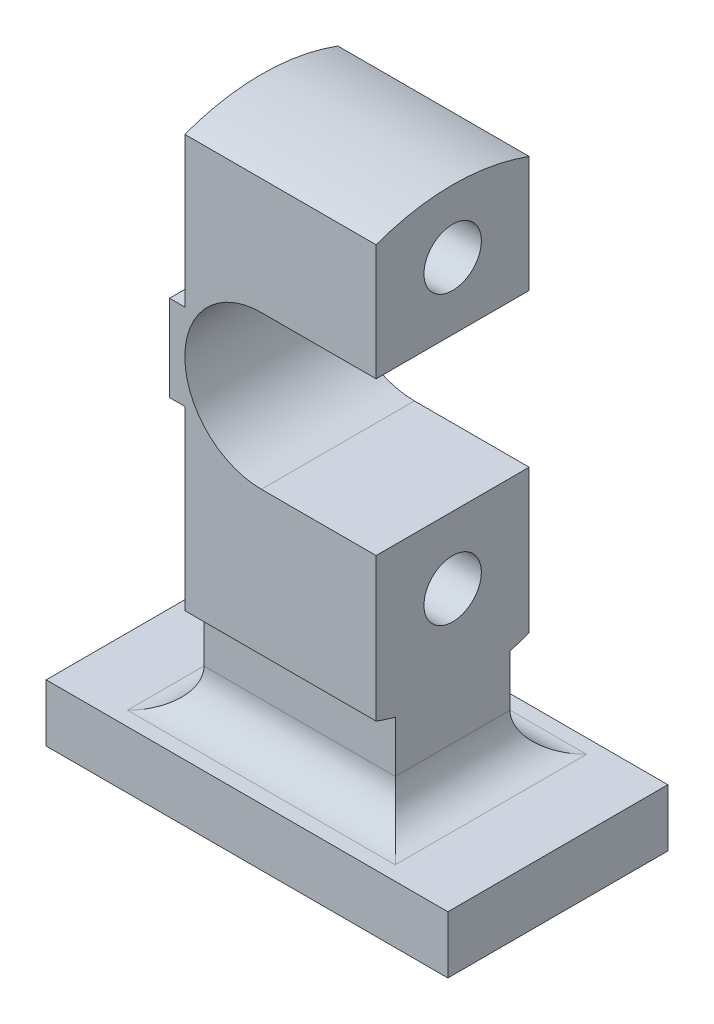
ISO-10303-21;
HEADER;
FILE_DESCRIPTION(('STEP AP214'),'2;1');
FILE_NAME('part.step','',(''),(''),'','','');
FILE_SCHEMA(('AUTOMOTIVE_DESIGN { 1 0 10303 214 1 1 1 1 }'));
ENDSEC;
DATA;
#1=APPLICATION_CONTEXT('core data for automotive mechanical design processes');
#2=APPLICATION_PROTOCOL_DEFINITION('international standard','automotive_design',2000,#1);
#3=PRODUCT_CONTEXT('',#1,'mechanical');
#4=PRODUCT('Part','Part','',(#3));
#5=PRODUCT_RELATED_PRODUCT_CATEGORY('part','',(#4));
#6=PRODUCT_DEFINITION_FORMATION('','',#4);
#7=PRODUCT_DEFINITION_CONTEXT('part definition',#1,'design');
#8=PRODUCT_DEFINITION('design','',#6,#7);
#9=PRODUCT_DEFINITION_SHAPE('','',#8);
#10=(LENGTH_UNIT() NAMED_UNIT(*) SI_UNIT(.MILLI.,.METRE.));
#11=(NAMED_UNIT(*) PLANE_ANGLE_UNIT() SI_UNIT($,.RADIAN.));
#12=(NAMED_UNIT(*) SI_UNIT($,.STERADIAN.) SOLID_ANGLE_UNIT());
#13=UNCERTAINTY_MEASURE_WITH_UNIT(LENGTH_MEASURE(1.E-05),#10,'distance_accuracy_value','');
#14=(GEOMETRIC_REPRESENTATION_CONTEXT(3) GLOBAL_UNCERTAINTY_ASSIGNED_CONTEXT((#13)) GLOBAL_UNIT_ASSIGNED_CONTEXT((#10,
#11,#12)) REPRESENTATION_CONTEXT('',''));
#15=CARTESIAN_POINT('',(0.,0.,0.));
#16=DIRECTION('',(0.,0.,1.));
#17=DIRECTION('',(1.,0.,0.));
#18=AXIS2_PLACEMENT_3D('',#15,#16,#17);
#19=CARTESIAN_POINT('',(50.,0.,0.));
#20=DIRECTION('',(1.,0.,0.));
#21=DIRECTION('',(0.,0.,-1.));
#22=AXIS2_PLACEMENT_3D('',#19,#20,#21);
#23=PLANE('',#22);
#24=CARTESIAN_POINT('',(50.,120.,0.));
#25=DIRECTION('',(1.,0.,0.));
#26=DIRECTION('',(0.,0.,-1.));
#27=AXIS2_PLACEMENT_3D('',#24,#25,#26);
#28=CIRCLE('',#27,15.);
#29=CARTESIAN_POINT('',(50.,120.,-15.));
#30=VERTEX_POINT('',#29);
#31=EDGE_CURVE('E240',#30,#30,#28,.T.);
#32=ORIENTED_EDGE('',*,*,#31,.F.);
#33=EDGE_LOOP('',(#32));
#34=FACE_BOUND('',#33,.T.);
#35=DIRECTION('',(0.,1.,0.));
#36=VECTOR('',#35,1.);
#37=CARTESIAN_POINT('',(50.,295.680123104319,-40.));
#38=LINE('',#37,#36);
#39=CARTESIAN_POINT('',(50.,80.0415365758403,-40.));
#40=VERTEX_POINT('',#39);
#41=CARTESIAN_POINT('',(50.,155.,-40.));
#42=VERTEX_POINT('',#41);
#43=EDGE_CURVE('E259',#40,#42,#38,.T.);
#44=ORIENTED_EDGE('',*,*,#43,.T.);
#45=DIRECTION('',(0.,0.,-1.));
#46=VECTOR('',#45,1.);
#47=CARTESIAN_POINT('',(50.,155.,57.5));
#48=LINE('',#47,#46);
#49=CARTESIAN_POINT('',(50.,155.,40.));
#50=VERTEX_POINT('',#49);
#51=EDGE_CURVE('E201',#50,#42,#48,.T.);
#52=ORIENTED_EDGE('',*,*,#51,.F.);
#53=DIRECTION('',(0.,-1.,0.));
#54=VECTOR('',#53,1.);
#55=CARTESIAN_POINT('',(50.,295.680123104319,40.));
#56=LINE('',#55,#54);
#57=CARTESIAN_POINT('',(50.,80.0415365758403,40.));
#58=VERTEX_POINT('',#57);
#59=EDGE_CURVE('E263',#50,#58,#56,.T.);
#60=ORIENTED_EDGE('',*,*,#59,.T.);
#61=CARTESIAN_POINT('',(50.,187.860829840079,0.));
#62=DIRECTION('',(1.,0.,0.));
#63=DIRECTION('',(0.,0.,-1.));
#64=AXIS2_PLACEMENT_3D('',#61,#62,#63);
#65=CIRCLE('',#64,115.);
#66=CARTESIAN_POINT('',(50.,76.8428132842069,30.));
#67=VERTEX_POINT('',#66);
#68=EDGE_CURVE('E254',#58,#67,#65,.T.);
#69=ORIENTED_EDGE('',*,*,#68,.T.);
#70=DIRECTION('',(0.,-1.,0.));
#71=VECTOR('',#70,1.);
#72=CARTESIAN_POINT('',(50.,25.3292008694039,30.));
#73=LINE('',#72,#71);
#74=CARTESIAN_POINT('',(50.,50.,30.));
#75=VERTEX_POINT('',#74);
#76=EDGE_CURVE('E301',#67,#75,#73,.T.);
#77=ORIENTED_EDGE('',*,*,#76,.T.);
#78=DIRECTION('',(0.,0.,-1.));
#79=VECTOR('',#78,1.);
#80=CARTESIAN_POINT('',(50.,50.,-30.));
#81=LINE('',#80,#79);
#82=CARTESIAN_POINT('',(50.,50.,-30.));
#83=VERTEX_POINT('',#82);
#84=EDGE_CURVE('E352',#75,#83,#81,.T.);
#85=ORIENTED_EDGE('',*,*,#84,.T.);
#86=DIRECTION('',(0.,1.,0.));
#87=VECTOR('',#86,1.);
#88=CARTESIAN_POINT('',(50.,25.3292008694039,-30.));
#89=LINE('',#88,#87);
#90=CARTESIAN_POINT('',(50.,76.8428132842069,-30.));
#91=VERTEX_POINT('',#90);
#92=EDGE_CURVE('E299',#83,#91,#89,.T.);
#93=ORIENTED_EDGE('',*,*,#92,.T.);
#94=EDGE_CURVE('E258',#91,#40,#65,.T.);
#95=ORIENTED_EDGE('',*,*,#94,.T.);
#96=EDGE_LOOP('',(#44,#52,#60,#69,#77,#85,#93,#95));
#97=FACE_BOUND('',#96,.T.);
#98=ADVANCED_FACE('F39',(#34,#97),#23,.T.);
#99=CARTESIAN_POINT('',(50.,295.680123104319,-40.));
#100=DIRECTION('',(0.,0.,1.));
#101=DIRECTION('',(0.,-1.,0.));
#102=AXIS2_PLACEMENT_3D('',#99,#100,#101);
#103=PLANE('',#102);
#104=DIRECTION('',(1.,0.,0.));
#105=VECTOR('',#104,1.);
#106=CARTESIAN_POINT('',(0.,155.,-40.));
#107=LINE('',#106,#105);
#108=CARTESIAN_POINT('',(-10.,155.,-40.));
#109=VERTEX_POINT('',#108);
#110=EDGE_CURVE('E198',#109,#42,#107,.T.);
#111=ORIENTED_EDGE('',*,*,#110,.T.);
#112=ORIENTED_EDGE('',*,*,#43,.F.);
#113=DIRECTION('',(-1.,0.,0.));
#114=VECTOR('',#113,1.);
#115=CARTESIAN_POINT('',(50.,80.0415365758403,-40.));
#116=LINE('',#115,#114);
#117=CARTESIAN_POINT('',(-50.,80.0415365758403,-40.));
#118=VERTEX_POINT('',#117);
#119=EDGE_CURVE('E289',#40,#118,#116,.T.);
#120=ORIENTED_EDGE('',*,*,#119,.T.);
#121=DIRECTION('',(0.,1.,0.));
#122=VECTOR('',#121,1.);
#123=CARTESIAN_POINT('',(-50.,295.680123104319,-40.));
#124=LINE('',#123,#122);
#125=CARTESIAN_POINT('',(-50.,172.5,-40.));
#126=VERTEX_POINT('',#125);
#127=EDGE_CURVE('E272',#118,#126,#124,.T.);
#128=ORIENTED_EDGE('',*,*,#127,.T.);
#129=DIRECTION('',(-1.,0.,0.));
#130=VECTOR('',#129,1.);
#131=CARTESIAN_POINT('',(0.,172.5,-40.));
#132=LINE('',#131,#130);
#133=CARTESIAN_POINT('',(-58.,172.5,-40.));
#134=VERTEX_POINT('',#133);
#135=EDGE_CURVE('E220',#126,#134,#132,.T.);
#136=ORIENTED_EDGE('',*,*,#135,.T.);
#137=DIRECTION('',(0.,-1.,0.));
#138=VECTOR('',#137,1.);
#139=CARTESIAN_POINT('',(-58.,0.,-40.));
#140=LINE('',#139,#138);
#141=CARTESIAN_POINT('',(-58.,217.5,-40.));
#142=VERTEX_POINT('',#141);
#143=EDGE_CURVE('E212',#142,#134,#140,.T.);
#144=ORIENTED_EDGE('',*,*,#143,.F.);
#145=DIRECTION('',(-1.,0.,0.));
#146=VECTOR('',#145,1.);
#147=CARTESIAN_POINT('',(7.5460471204991E-13,217.5,-40.));
#148=LINE('',#147,#146);
#149=CARTESIAN_POINT('',(-50.,217.5,-40.));
#150=VERTEX_POINT('',#149);
#151=EDGE_CURVE('E226',#150,#142,#148,.T.);
#152=ORIENTED_EDGE('',*,*,#151,.F.);
#153=CARTESIAN_POINT('',(-50.,295.680123104319,-40.));
#154=VERTEX_POINT('',#153);
#155=EDGE_CURVE('E271',#150,#154,#124,.T.);
#156=ORIENTED_EDGE('',*,*,#155,.T.);
#157=DIRECTION('',(-1.,0.,0.));
#158=VECTOR('',#157,1.);
#159=CARTESIAN_POINT('',(50.,295.680123104319,-40.));
#160=LINE('',#159,#158);
#161=CARTESIAN_POINT('',(50.,295.680123104319,-40.));
#162=VERTEX_POINT('',#161);
#163=EDGE_CURVE('E286',#162,#154,#160,.T.);
#164=ORIENTED_EDGE('',*,*,#163,.F.);
#165=CARTESIAN_POINT('',(50.,235.,-40.));
#166=VERTEX_POINT('',#165);
#167=EDGE_CURVE('E257',#166,#162,#38,.T.);
#168=ORIENTED_EDGE('',*,*,#167,.F.);
#169=DIRECTION('',(1.,0.,0.));
#170=VECTOR('',#169,1.);
#171=CARTESIAN_POINT('',(0.,235.,-40.));
#172=LINE('',#171,#170);
#173=CARTESIAN_POINT('',(-10.,235.,-40.));
#174=VERTEX_POINT('',#173);
#175=EDGE_CURVE('E195',#174,#166,#172,.T.);
#176=ORIENTED_EDGE('',*,*,#175,.F.);
#177=CARTESIAN_POINT('',(-10.,195.,-40.));
#178=DIRECTION('',(0.,0.,-1.));
#179=DIRECTION('',(0.,1.,0.));
#180=AXIS2_PLACEMENT_3D('',#177,#178,#179);
#181=CIRCLE('',#180,40.);
#182=EDGE_CURVE('E189',#109,#174,#181,.T.);
#183=ORIENTED_EDGE('',*,*,#182,.F.);
#184=EDGE_LOOP('',(#111,#112,#120,#128,#136,#144,#152,#156,#164,#168,#176,#183));
#185=FACE_BOUND('',#184,.T.);
#186=ADVANCED_FACE('F206',(#185),#103,.F.);
#187=CARTESIAN_POINT('',(50.,295.680123104319,40.));
#188=DIRECTION('',(0.,0.,-1.));
#189=DIRECTION('',(0.,1.,0.));
#190=AXIS2_PLACEMENT_3D('',#187,#188,#189);
#191=PLANE('',#190);
#192=DIRECTION('',(1.,0.,0.));
#193=VECTOR('',#192,1.);
#194=CARTESIAN_POINT('',(50.,155.,40.));
#195=LINE('',#194,#193);
#196=CARTESIAN_POINT('',(-10.,155.,40.));
#197=VERTEX_POINT('',#196);
#198=EDGE_CURVE('E11',#197,#50,#195,.T.);
#199=ORIENTED_EDGE('',*,*,#198,.F.);
#200=CARTESIAN_POINT('',(-10.,195.,40.));
#201=DIRECTION('',(0.,0.,-1.));
#202=DIRECTION('',(0.,1.,0.));
#203=AXIS2_PLACEMENT_3D('',#200,#201,#202);
#204=CIRCLE('',#203,40.);
#205=CARTESIAN_POINT('',(-10.,235.,40.));
#206=VERTEX_POINT('',#205);
#207=EDGE_CURVE('E192',#197,#206,#204,.T.);
#208=ORIENTED_EDGE('',*,*,#207,.T.);
#209=DIRECTION('',(1.,0.,0.));
#210=VECTOR('',#209,1.);
#211=CARTESIAN_POINT('',(50.,235.,40.));
#212=LINE('',#211,#210);
#213=CARTESIAN_POINT('',(50.,235.,40.));
#214=VERTEX_POINT('',#213);
#215=EDGE_CURVE('E47',#206,#214,#212,.T.);
#216=ORIENTED_EDGE('',*,*,#215,.T.);
#217=CARTESIAN_POINT('',(50.,295.680123104319,40.));
#218=VERTEX_POINT('',#217);
#219=EDGE_CURVE('E264',#218,#214,#56,.T.);
#220=ORIENTED_EDGE('',*,*,#219,.F.);
#221=DIRECTION('',(-1.,0.,0.));
#222=VECTOR('',#221,1.);
#223=CARTESIAN_POINT('',(50.,295.680123104319,40.));
#224=LINE('',#223,#222);
#225=CARTESIAN_POINT('',(-50.,295.680123104319,40.));
#226=VERTEX_POINT('',#225);
#227=EDGE_CURVE('E283',#218,#226,#224,.T.);
#228=ORIENTED_EDGE('',*,*,#227,.T.);
#229=DIRECTION('',(0.,-1.,0.));
#230=VECTOR('',#229,1.);
#231=CARTESIAN_POINT('',(-50.,295.680123104319,40.));
#232=LINE('',#231,#230);
#233=CARTESIAN_POINT('',(-50.,217.5,40.));
#234=VERTEX_POINT('',#233);
#235=EDGE_CURVE('E278',#226,#234,#232,.T.);
#236=ORIENTED_EDGE('',*,*,#235,.T.);
#237=DIRECTION('',(-1.,0.,0.));
#238=VECTOR('',#237,1.);
#239=CARTESIAN_POINT('',(7.5460471204991E-13,217.5,40.));
#240=LINE('',#239,#238);
#241=CARTESIAN_POINT('',(-58.,217.5,40.));
#242=VERTEX_POINT('',#241);
#243=EDGE_CURVE('E219',#234,#242,#240,.T.);
#244=ORIENTED_EDGE('',*,*,#243,.T.);
#245=DIRECTION('',(0.,-1.,0.));
#246=VECTOR('',#245,1.);
#247=CARTESIAN_POINT('',(-58.,0.,40.));
#248=LINE('',#247,#246);
#249=CARTESIAN_POINT('',(-58.,172.5,40.));
#250=VERTEX_POINT('',#249);
#251=EDGE_CURVE('E217',#242,#250,#248,.T.);
#252=ORIENTED_EDGE('',*,*,#251,.T.);
#253=DIRECTION('',(-1.,0.,0.));
#254=VECTOR('',#253,1.);
#255=CARTESIAN_POINT('',(0.,172.5,40.));
#256=LINE('',#255,#254);
#257=CARTESIAN_POINT('',(-50.,172.5,40.));
#258=VERTEX_POINT('',#257);
#259=EDGE_CURVE('E62',#258,#250,#256,.T.);
#260=ORIENTED_EDGE('',*,*,#259,.F.);
#261=CARTESIAN_POINT('',(-50.,80.0415365758403,40.));
#262=VERTEX_POINT('',#261);
#263=EDGE_CURVE('E277',#258,#262,#232,.T.);
#264=ORIENTED_EDGE('',*,*,#263,.T.);
#265=DIRECTION('',(-1.,0.,0.));
#266=VECTOR('',#265,1.);
#267=CARTESIAN_POINT('',(50.,80.0415365758403,40.));
#268=LINE('',#267,#266);
#269=EDGE_CURVE('E267',#58,#262,#268,.T.);
#270=ORIENTED_EDGE('',*,*,#269,.F.);
#271=ORIENTED_EDGE('',*,*,#59,.F.);
#272=EDGE_LOOP('',(#199,#208,#216,#220,#228,#236,#244,#252,#260,#264,#270,#271));
#273=FACE_BOUND('',#272,.T.);
#274=ADVANCED_FACE('F366',(#273),#191,.F.);
#275=CARTESIAN_POINT('',(-50.,0.,0.));
#276=DIRECTION('',(1.,0.,0.));
#277=DIRECTION('',(0.,0.,-1.));
#278=AXIS2_PLACEMENT_3D('',#275,#276,#277);
#279=PLANE('',#278);
#280=CARTESIAN_POINT('',(-50.,270.,0.));
#281=DIRECTION('',(1.,0.,0.));
#282=DIRECTION('',(0.,0.,-1.));
#283=AXIS2_PLACEMENT_3D('',#280,#281,#282);
#284=CIRCLE('',#283,15.);
#285=CARTESIAN_POINT('',(-50.,270.,-15.));
#286=VERTEX_POINT('',#285);
#287=EDGE_CURVE('E243',#286,#286,#284,.T.);
#288=ORIENTED_EDGE('',*,*,#287,.T.);
#289=EDGE_LOOP('',(#288));
#290=FACE_BOUND('',#289,.T.);
#291=DIRECTION('',(0.,0.,-1.));
#292=VECTOR('',#291,1.);
#293=CARTESIAN_POINT('',(-50.,217.5,40.));
#294=LINE('',#293,#292);
#295=EDGE_CURVE('E236',#234,#150,#294,.T.);
#296=ORIENTED_EDGE('',*,*,#295,.F.);
#297=ORIENTED_EDGE('',*,*,#235,.F.);
#298=CARTESIAN_POINT('',(-50.,187.860829840079,0.));
#299=DIRECTION('',(1.,0.,0.));
#300=DIRECTION('',(0.,0.,-1.));
#301=AXIS2_PLACEMENT_3D('',#298,#299,#300);
#302=CIRCLE('',#301,115.);
#303=EDGE_CURVE('E275',#154,#226,#302,.T.);
#304=ORIENTED_EDGE('',*,*,#303,.F.);
#305=ORIENTED_EDGE('',*,*,#155,.F.);
#306=EDGE_LOOP('',(#296,#297,#304,#305));
#307=FACE_BOUND('',#306,.T.);
#308=ADVANCED_FACE('F380',(#290,#307),#279,.F.);
#309=CARTESIAN_POINT('',(50.,25.3292008694039,-30.));
#310=DIRECTION('',(0.,0.,1.));
#311=DIRECTION('',(1.,0.,0.));
#312=AXIS2_PLACEMENT_3D('',#309,#310,#311);
#313=PLANE('',#312);
#314=ORIENTED_EDGE('',*,*,#92,.F.);
#315=DIRECTION('',(1.,0.,0.));
#316=VECTOR('',#315,1.);
#317=CARTESIAN_POINT('',(50.,50.,-30.));
#318=LINE('',#317,#316);
#319=CARTESIAN_POINT('',(-50.,50.,-30.));
#320=VERTEX_POINT('',#319);
#321=EDGE_CURVE('E350',#83,#320,#318,.F.);
#322=ORIENTED_EDGE('',*,*,#321,.T.);
#323=DIRECTION('',(0.,1.,0.));
#324=VECTOR('',#323,1.);
#325=CARTESIAN_POINT('',(-50.,25.3292008694039,-30.));
#326=LINE('',#325,#324);
#327=CARTESIAN_POINT('',(-50.,76.8428132842069,-30.));
#328=VERTEX_POINT('',#327);
#329=EDGE_CURVE('E298',#320,#328,#326,.T.);
#330=ORIENTED_EDGE('',*,*,#329,.T.);
#331=DIRECTION('',(-1.,0.,0.));
#332=VECTOR('',#331,1.);
#333=CARTESIAN_POINT('',(50.,76.8428132842069,-30.));
#334=LINE('',#333,#332);
#335=EDGE_CURVE('E295',#91,#328,#334,.T.);
#336=ORIENTED_EDGE('',*,*,#335,.F.);
#337=EDGE_LOOP('',(#314,#322,#330,#336));
#338=FACE_BOUND('',#337,.T.);
#339=ADVANCED_FACE('F439',(#338),#313,.F.);
#340=CARTESIAN_POINT('',(50.,25.3292008694039,30.));
#341=DIRECTION('',(0.,0.,-1.));
#342=DIRECTION('',(-1.,0.,0.));
#343=AXIS2_PLACEMENT_3D('',#340,#341,#342);
#344=PLANE('',#343);
#345=DIRECTION('',(0.,-1.,0.));
#346=VECTOR('',#345,1.);
#347=CARTESIAN_POINT('',(-50.,25.3292008694039,30.));
#348=LINE('',#347,#346);
#349=CARTESIAN_POINT('',(-50.,76.8428132842069,30.));
#350=VERTEX_POINT('',#349);
#351=CARTESIAN_POINT('',(-50.,50.,30.));
#352=VERTEX_POINT('',#351);
#353=EDGE_CURVE('E302',#350,#352,#348,.T.);
#354=ORIENTED_EDGE('',*,*,#353,.T.);
#355=DIRECTION('',(-1.,0.,0.));
#356=VECTOR('',#355,1.);
#357=CARTESIAN_POINT('',(50.,50.,30.));
#358=LINE('',#357,#356);
#359=EDGE_CURVE('E354',#352,#75,#358,.F.);
#360=ORIENTED_EDGE('',*,*,#359,.T.);
#361=ORIENTED_EDGE('',*,*,#76,.F.);
#362=DIRECTION('',(-1.,0.,0.));
#363=VECTOR('',#362,1.);
#364=CARTESIAN_POINT('',(50.,76.8428132842069,30.));
#365=LINE('',#364,#363);
#366=EDGE_CURVE('E292',#350,#67,#365,.F.);
#367=ORIENTED_EDGE('',*,*,#366,.F.);
#368=EDGE_LOOP('',(#354,#360,#361,#367));
#369=FACE_BOUND('',#368,.T.);
#370=ADVANCED_FACE('F436',(#369),#344,.F.);
#371=CARTESIAN_POINT('',(105.,30.,-57.5));
#372=DIRECTION('',(-1.,0.,0.));
#373=DIRECTION('',(0.,0.,1.));
#374=AXIS2_PLACEMENT_3D('',#371,#372,#373);
#375=PLANE('',#374);
#376=DIRECTION('',(0.,0.,-1.));
#377=VECTOR('',#376,1.);
#378=CARTESIAN_POINT('',(105.,0.,-57.5));
#379=LINE('',#378,#377);
#380=CARTESIAN_POINT('',(105.,0.,57.5));
#381=VERTEX_POINT('',#380);
#382=CARTESIAN_POINT('',(105.,0.,-57.5));
#383=VERTEX_POINT('',#382);
#384=EDGE_CURVE('E305',#381,#383,#379,.T.);
#385=ORIENTED_EDGE('',*,*,#384,.T.);
#386=DIRECTION('',(0.,-1.,0.));
#387=VECTOR('',#386,1.);
#388=CARTESIAN_POINT('',(105.,30.,-57.5));
#389=LINE('',#388,#387);
#390=CARTESIAN_POINT('',(105.,30.,-57.5));
#391=VERTEX_POINT('',#390);
#392=EDGE_CURVE('E335',#391,#383,#389,.T.);
#393=ORIENTED_EDGE('',*,*,#392,.F.);
#394=DIRECTION('',(0.,0.,-1.));
#395=VECTOR('',#394,1.);
#396=CARTESIAN_POINT('',(105.,30.,-57.5));
#397=LINE('',#396,#395);
#398=CARTESIAN_POINT('',(105.,30.,57.5));
#399=VERTEX_POINT('',#398);
#400=EDGE_CURVE('E309',#399,#391,#397,.T.);
#401=ORIENTED_EDGE('',*,*,#400,.F.);
#402=DIRECTION('',(0.,-1.,0.));
#403=VECTOR('',#402,1.);
#404=CARTESIAN_POINT('',(105.,30.,57.5));
#405=LINE('',#404,#403);
#406=EDGE_CURVE('E319',#399,#381,#405,.T.);
#407=ORIENTED_EDGE('',*,*,#406,.T.);
#408=EDGE_LOOP('',(#385,#393,#401,#407));
#409=FACE_BOUND('',#408,.T.);
#410=ADVANCED_FACE('F438',(#409),#375,.F.);
#411=CARTESIAN_POINT('',(-105.,30.,-57.5));
#412=DIRECTION('',(0.,0.,1.));
#413=DIRECTION('',(1.,0.,0.));
#414=AXIS2_PLACEMENT_3D('',#411,#412,#413);
#415=PLANE('',#414);
#416=DIRECTION('',(-1.,0.,0.));
#417=VECTOR('',#416,1.);
#418=CARTESIAN_POINT('',(-105.,0.,-57.5));
#419=LINE('',#418,#417);
#420=CARTESIAN_POINT('',(-105.,0.,-57.5));
#421=VERTEX_POINT('',#420);
#422=EDGE_CURVE('E322',#383,#421,#419,.T.);
#423=ORIENTED_EDGE('',*,*,#422,.T.);
#424=DIRECTION('',(0.,-1.,0.));
#425=VECTOR('',#424,1.);
#426=CARTESIAN_POINT('',(-105.,30.,-57.5));
#427=LINE('',#426,#425);
#428=CARTESIAN_POINT('',(-105.,30.,-57.5));
#429=VERTEX_POINT('',#428);
#430=EDGE_CURVE('E332',#429,#421,#427,.T.);
#431=ORIENTED_EDGE('',*,*,#430,.F.);
#432=DIRECTION('',(-1.,0.,0.));
#433=VECTOR('',#432,1.);
#434=CARTESIAN_POINT('',(-105.,30.,-57.5));
#435=LINE('',#434,#433);
#436=EDGE_CURVE('E312',#391,#429,#435,.T.);
#437=ORIENTED_EDGE('',*,*,#436,.F.);
#438=ORIENTED_EDGE('',*,*,#392,.T.);
#439=EDGE_LOOP('',(#423,#431,#437,#438));
#440=FACE_BOUND('',#439,.T.);
#441=ADVANCED_FACE('F445',(#440),#415,.F.);
#442=CARTESIAN_POINT('',(-105.,30.,-57.5));
#443=DIRECTION('',(1.,0.,0.));
#444=DIRECTION('',(0.,0.,-1.));
#445=AXIS2_PLACEMENT_3D('',#442,#443,#444);
#446=PLANE('',#445);
#447=DIRECTION('',(0.,0.,1.));
#448=VECTOR('',#447,1.);
#449=CARTESIAN_POINT('',(-105.,0.,-57.5));
#450=LINE('',#449,#448);
#451=CARTESIAN_POINT('',(-105.,0.,57.5));
#452=VERTEX_POINT('',#451);
#453=EDGE_CURVE('E324',#421,#452,#450,.T.);
#454=ORIENTED_EDGE('',*,*,#453,.T.);
#455=DIRECTION('',(0.,-1.,0.));
#456=VECTOR('',#455,1.);
#457=CARTESIAN_POINT('',(-105.,30.,57.5));
#458=LINE('',#457,#456);
#459=CARTESIAN_POINT('',(-105.,30.,57.5));
#460=VERTEX_POINT('',#459);
#461=EDGE_CURVE('E329',#460,#452,#458,.T.);
#462=ORIENTED_EDGE('',*,*,#461,.F.);
#463=DIRECTION('',(0.,0.,1.));
#464=VECTOR('',#463,1.);
#465=CARTESIAN_POINT('',(-105.,30.,-57.5));
#466=LINE('',#465,#464);
#467=EDGE_CURVE('E315',#429,#460,#466,.T.);
#468=ORIENTED_EDGE('',*,*,#467,.F.);
#469=ORIENTED_EDGE('',*,*,#430,.T.);
#470=EDGE_LOOP('',(#454,#462,#468,#469));
#471=FACE_BOUND('',#470,.T.);
#472=ADVANCED_FACE('F476',(#471),#446,.F.);
#473=CARTESIAN_POINT('',(-105.,30.,57.5));
#474=DIRECTION('',(0.,0.,-1.));
#475=DIRECTION('',(-1.,0.,0.));
#476=AXIS2_PLACEMENT_3D('',#473,#474,#475);
#477=PLANE('',#476);
#478=DIRECTION('',(1.,0.,0.));
#479=VECTOR('',#478,1.);
#480=CARTESIAN_POINT('',(-105.,0.,57.5));
#481=LINE('',#480,#479);
#482=EDGE_CURVE('E313',#452,#381,#481,.T.);
#483=ORIENTED_EDGE('',*,*,#482,.T.);
#484=ORIENTED_EDGE('',*,*,#406,.F.);
#485=DIRECTION('',(1.,0.,0.));
#486=VECTOR('',#485,1.);
#487=CARTESIAN_POINT('',(-105.,30.,57.5));
#488=LINE('',#487,#486);
#489=EDGE_CURVE('E317',#460,#399,#488,.T.);
#490=ORIENTED_EDGE('',*,*,#489,.F.);
#491=ORIENTED_EDGE('',*,*,#461,.T.);
#492=EDGE_LOOP('',(#483,#484,#490,#491));
#493=FACE_BOUND('',#492,.T.);
#494=ADVANCED_FACE('F470',(#493),#477,.F.);
#495=CARTESIAN_POINT('',(0.,30.,0.));
#496=DIRECTION('',(0.,1.,0.));
#497=DIRECTION('',(0.,0.,1.));
#498=AXIS2_PLACEMENT_3D('',#495,#496,#497);
#499=PLANE('',#498);
#500=DIRECTION('',(-1.,0.,0.));
#501=VECTOR('',#500,1.);
#502=CARTESIAN_POINT('',(0.,30.,50.));
#503=LINE('',#502,#501);
#504=CARTESIAN_POINT('',(70.,30.,50.));
#505=VERTEX_POINT('',#504);
#506=CARTESIAN_POINT('',(-70.,30.,50.));
#507=VERTEX_POINT('',#506);
#508=EDGE_CURVE('E338',#505,#507,#503,.T.);
#509=ORIENTED_EDGE('',*,*,#508,.T.);
#510=DIRECTION('',(0.,0.,-1.));
#511=VECTOR('',#510,1.);
#512=CARTESIAN_POINT('',(-70.,30.,0.));
#513=LINE('',#512,#511);
#514=CARTESIAN_POINT('',(-70.,30.,-50.));
#515=VERTEX_POINT('',#514);
#516=EDGE_CURVE('E344',#507,#515,#513,.T.);
#517=ORIENTED_EDGE('',*,*,#516,.T.);
#518=DIRECTION('',(1.,0.,0.));
#519=VECTOR('',#518,1.);
#520=CARTESIAN_POINT('',(0.,30.,-50.));
#521=LINE('',#520,#519);
#522=CARTESIAN_POINT('',(70.,30.,-50.));
#523=VERTEX_POINT('',#522);
#524=EDGE_CURVE('E342',#515,#523,#521,.T.);
#525=ORIENTED_EDGE('',*,*,#524,.T.);
#526=DIRECTION('',(0.,0.,-1.));
#527=VECTOR('',#526,1.);
#528=CARTESIAN_POINT('',(70.,30.,30.));
#529=LINE('',#528,#527);
#530=EDGE_CURVE('E340',#523,#505,#529,.F.);
#531=ORIENTED_EDGE('',*,*,#530,.T.);
#532=EDGE_LOOP('',(#509,#517,#525,#531));
#533=FACE_BOUND('',#532,.T.);
#534=ORIENTED_EDGE('',*,*,#400,.T.);
#535=ORIENTED_EDGE('',*,*,#436,.T.);
#536=ORIENTED_EDGE('',*,*,#467,.T.);
#537=ORIENTED_EDGE('',*,*,#489,.T.);
#538=EDGE_LOOP('',(#534,#535,#536,#537));
#539=FACE_BOUND('',#538,.T.);
#540=ADVANCED_FACE('F429',(#533,#539),#499,.T.);
#541=CARTESIAN_POINT('',(0.,0.,0.));
#542=DIRECTION('',(0.,1.,0.));
#543=DIRECTION('',(0.,0.,1.));
#544=AXIS2_PLACEMENT_3D('',#541,#542,#543);
#545=PLANE('',#544);
#546=ORIENTED_EDGE('',*,*,#384,.F.);
#547=ORIENTED_EDGE('',*,*,#482,.F.);
#548=ORIENTED_EDGE('',*,*,#453,.F.);
#549=ORIENTED_EDGE('',*,*,#422,.F.);
#550=EDGE_LOOP('',(#546,#547,#548,#549));
#551=FACE_BOUND('',#550,.T.);
#552=ADVANCED_FACE('F460',(#551),#545,.F.);
#553=DIRECTION('',(0.,0.,-1.));
#554=VECTOR('',#553,1.);
#555=CARTESIAN_POINT('',(50.,235.,57.5));
#556=LINE('',#555,#554);
#557=EDGE_CURVE('E213',#214,#166,#556,.T.);
#558=ORIENTED_EDGE('',*,*,#557,.T.);
#559=ORIENTED_EDGE('',*,*,#167,.T.);
#560=CARTESIAN_POINT('',(50.,187.860829840079,0.));
#561=DIRECTION('',(1.,0.,0.));
#562=DIRECTION('',(0.,0.,-1.));
#563=AXIS2_PLACEMENT_3D('',#560,#561,#562);
#564=CIRCLE('',#563,115.);
#565=EDGE_CURVE('E261',#162,#218,#564,.T.);
#566=ORIENTED_EDGE('',*,*,#565,.T.);
#567=ORIENTED_EDGE('',*,*,#219,.T.);
#568=EDGE_LOOP('',(#558,#559,#566,#567));
#569=FACE_BOUND('',#568,.T.);
#570=CARTESIAN_POINT('',(50.,270.,0.));
#571=DIRECTION('',(1.,0.,0.));
#572=DIRECTION('',(0.,0.,-1.));
#573=AXIS2_PLACEMENT_3D('',#570,#571,#572);
#574=CIRCLE('',#573,15.);
#575=CARTESIAN_POINT('',(50.,270.,-15.));
#576=VERTEX_POINT('',#575);
#577=EDGE_CURVE('E248',#576,#576,#574,.T.);
#578=ORIENTED_EDGE('',*,*,#577,.F.);
#579=EDGE_LOOP('',(#578));
#580=FACE_BOUND('',#579,.T.);
#581=ADVANCED_FACE('F369',(#569,#580),#23,.T.);
#582=ORIENTED_EDGE('',*,*,#263,.F.);
#583=DIRECTION('',(0.,0.,-1.));
#584=VECTOR('',#583,1.);
#585=CARTESIAN_POINT('',(-50.,172.5,40.));
#586=LINE('',#585,#584);
#587=EDGE_CURVE('E233',#258,#126,#586,.T.);
#588=ORIENTED_EDGE('',*,*,#587,.T.);
#589=ORIENTED_EDGE('',*,*,#127,.F.);
#590=CARTESIAN_POINT('',(-50.,187.860829840079,0.));
#591=DIRECTION('',(1.,0.,0.));
#592=DIRECTION('',(0.,0.,-1.));
#593=AXIS2_PLACEMENT_3D('',#590,#591,#592);
#594=CIRCLE('',#593,115.);
#595=EDGE_CURVE('E251',#328,#118,#594,.T.);
#596=ORIENTED_EDGE('',*,*,#595,.F.);
#597=ORIENTED_EDGE('',*,*,#329,.F.);
#598=DIRECTION('',(0.,0.,-1.));
#599=VECTOR('',#598,1.);
#600=CARTESIAN_POINT('',(-50.,50.,0.));
#601=LINE('',#600,#599);
#602=EDGE_CURVE('E347',#320,#352,#601,.F.);
#603=ORIENTED_EDGE('',*,*,#602,.T.);
#604=ORIENTED_EDGE('',*,*,#353,.F.);
#605=EDGE_CURVE('E268',#262,#350,#594,.T.);
#606=ORIENTED_EDGE('',*,*,#605,.F.);
#607=EDGE_LOOP('',(#582,#588,#589,#596,#597,#603,#604,#606));
#608=FACE_BOUND('',#607,.T.);
#609=CARTESIAN_POINT('',(-50.,120.,0.));
#610=DIRECTION('',(1.,0.,0.));
#611=DIRECTION('',(0.,0.,-1.));
#612=AXIS2_PLACEMENT_3D('',#609,#610,#611);
#613=CIRCLE('',#612,15.);
#614=CARTESIAN_POINT('',(-50.,120.,-15.));
#615=VERTEX_POINT('',#614);
#616=EDGE_CURVE('E244',#615,#615,#613,.T.);
#617=ORIENTED_EDGE('',*,*,#616,.T.);
#618=EDGE_LOOP('',(#617));
#619=FACE_BOUND('',#618,.T.);
#620=ADVANCED_FACE('F397',(#608,#619),#279,.F.);
#621=CARTESIAN_POINT('',(50.,187.860829840079,0.));
#622=DIRECTION('',(-1.,0.,0.));
#623=DIRECTION('',(0.,0.,1.));
#624=AXIS2_PLACEMENT_3D('',#621,#622,#623);
#625=CYLINDRICAL_SURFACE('',#624,115.);
#626=ORIENTED_EDGE('',*,*,#94,.F.);
#627=ORIENTED_EDGE('',*,*,#335,.T.);
#628=ORIENTED_EDGE('',*,*,#595,.T.);
#629=ORIENTED_EDGE('',*,*,#119,.F.);
#630=EDGE_LOOP('',(#626,#627,#628,#629));
#631=FACE_BOUND('',#630,.T.);
#632=ADVANCED_FACE('F410',(#631),#625,.T.);
#633=ORIENTED_EDGE('',*,*,#605,.T.);
#634=ORIENTED_EDGE('',*,*,#366,.T.);
#635=ORIENTED_EDGE('',*,*,#68,.F.);
#636=ORIENTED_EDGE('',*,*,#269,.T.);
#637=EDGE_LOOP('',(#633,#634,#635,#636));
#638=FACE_BOUND('',#637,.T.);
#639=ADVANCED_FACE('F404',(#638),#625,.T.);
#640=CARTESIAN_POINT('',(50.,187.860829840079,0.));
#641=DIRECTION('',(-1.,0.,0.));
#642=DIRECTION('',(0.,0.,1.));
#643=AXIS2_PLACEMENT_3D('',#640,#641,#642);
#644=CYLINDRICAL_SURFACE('',#643,115.);
#645=ORIENTED_EDGE('',*,*,#303,.T.);
#646=ORIENTED_EDGE('',*,*,#227,.F.);
#647=ORIENTED_EDGE('',*,*,#565,.F.);
#648=ORIENTED_EDGE('',*,*,#163,.T.);
#649=EDGE_LOOP('',(#645,#646,#647,#648));
#650=FACE_BOUND('',#649,.T.);
#651=ADVANCED_FACE('F375',(#650),#644,.T.);
#652=CARTESIAN_POINT('',(50.,270.,0.));
#653=DIRECTION('',(-1.,0.,0.));
#654=DIRECTION('',(0.,0.,1.));
#655=AXIS2_PLACEMENT_3D('',#652,#653,#654);
#656=CYLINDRICAL_SURFACE('',#655,15.);
#657=ORIENTED_EDGE('',*,*,#577,.T.);
#658=EDGE_LOOP('',(#657));
#659=FACE_BOUND('',#658,.T.);
#660=ORIENTED_EDGE('',*,*,#287,.F.);
#661=EDGE_LOOP('',(#660));
#662=FACE_BOUND('',#661,.T.);
#663=ADVANCED_FACE('F496',(#659,#662),#656,.F.);
#664=CARTESIAN_POINT('',(50.,120.,0.));
#665=DIRECTION('',(-1.,0.,0.));
#666=DIRECTION('',(0.,0.,1.));
#667=AXIS2_PLACEMENT_3D('',#664,#665,#666);
#668=CYLINDRICAL_SURFACE('',#667,15.);
#669=ORIENTED_EDGE('',*,*,#31,.T.);
#670=EDGE_LOOP('',(#669));
#671=FACE_BOUND('',#670,.T.);
#672=ORIENTED_EDGE('',*,*,#616,.F.);
#673=EDGE_LOOP('',(#672));
#674=FACE_BOUND('',#673,.T.);
#675=ADVANCED_FACE('F491',(#671,#674),#668,.F.);
#676=CARTESIAN_POINT('',(70.,50.,0.));
#677=DIRECTION('',(0.,0.,1.));
#678=DIRECTION('',(1.,0.,0.));
#679=AXIS2_PLACEMENT_3D('',#676,#677,#678);
#680=CYLINDRICAL_SURFACE('',#679,20.);
#681=CARTESIAN_POINT('',(70.,50.,-50.));
#682=DIRECTION('',(0.707106781186547,0.,0.707106781186547));
#683=DIRECTION('',(-0.707106781186547,0.,0.707106781186547));
#684=AXIS2_PLACEMENT_3D('',#681,#682,#683);
#685=ELLIPSE('',#684,28.2842712474619,20.);
#686=EDGE_CURVE('E359',#83,#523,#685,.T.);
#687=ORIENTED_EDGE('',*,*,#686,.F.);
#688=ORIENTED_EDGE('',*,*,#84,.F.);
#689=CARTESIAN_POINT('',(70.,50.,50.));
#690=DIRECTION('',(-0.707106781186547,0.,0.707106781186547));
#691=DIRECTION('',(-0.707106781186547,0.,-0.707106781186547));
#692=AXIS2_PLACEMENT_3D('',#689,#690,#691);
#693=ELLIPSE('',#692,28.2842712474619,20.);
#694=EDGE_CURVE('E247',#505,#75,#693,.F.);
#695=ORIENTED_EDGE('',*,*,#694,.F.);
#696=ORIENTED_EDGE('',*,*,#530,.F.);
#697=EDGE_LOOP('',(#687,#688,#695,#696));
#698=FACE_BOUND('',#697,.T.);
#699=ADVANCED_FACE('F41',(#698),#680,.F.);
#700=CARTESIAN_POINT('',(0.,50.,50.));
#701=DIRECTION('',(-1.,0.,0.));
#702=DIRECTION('',(0.,0.,1.));
#703=AXIS2_PLACEMENT_3D('',#700,#701,#702);
#704=CYLINDRICAL_SURFACE('',#703,20.);
#705=ORIENTED_EDGE('',*,*,#694,.T.);
#706=ORIENTED_EDGE('',*,*,#359,.F.);
#707=CARTESIAN_POINT('',(-70.,50.,50.));
#708=DIRECTION('',(-0.707106781186547,0.,-0.707106781186547));
#709=DIRECTION('',(-0.707106781186547,0.,0.707106781186547));
#710=AXIS2_PLACEMENT_3D('',#707,#708,#709);
#711=ELLIPSE('',#710,28.2842712474619,20.);
#712=EDGE_CURVE('E357',#507,#352,#711,.F.);
#713=ORIENTED_EDGE('',*,*,#712,.F.);
#714=ORIENTED_EDGE('',*,*,#508,.F.);
#715=EDGE_LOOP('',(#705,#706,#713,#714));
#716=FACE_BOUND('',#715,.T.);
#717=ADVANCED_FACE('F434',(#716),#704,.F.);
#718=CARTESIAN_POINT('',(0.,50.,-50.));
#719=DIRECTION('',(1.,0.,0.));
#720=DIRECTION('',(0.,0.,-1.));
#721=AXIS2_PLACEMENT_3D('',#718,#719,#720);
#722=CYLINDRICAL_SURFACE('',#721,20.);
#723=ORIENTED_EDGE('',*,*,#686,.T.);
#724=ORIENTED_EDGE('',*,*,#524,.F.);
#725=CARTESIAN_POINT('',(-70.,50.,-50.));
#726=DIRECTION('',(0.707106781186547,0.,-0.707106781186547));
#727=DIRECTION('',(0.707106781186547,0.,0.707106781186547));
#728=AXIS2_PLACEMENT_3D('',#725,#726,#727);
#729=ELLIPSE('',#728,28.2842712474619,20.);
#730=EDGE_CURVE('E232',#320,#515,#729,.T.);
#731=ORIENTED_EDGE('',*,*,#730,.F.);
#732=ORIENTED_EDGE('',*,*,#321,.F.);
#733=EDGE_LOOP('',(#723,#724,#731,#732));
#734=FACE_BOUND('',#733,.T.);
#735=ADVANCED_FACE('F425',(#734),#722,.F.);
#736=CARTESIAN_POINT('',(-70.,50.,0.));
#737=DIRECTION('',(0.,0.,-1.));
#738=DIRECTION('',(-1.,0.,0.));
#739=AXIS2_PLACEMENT_3D('',#736,#737,#738);
#740=CYLINDRICAL_SURFACE('',#739,20.);
#741=ORIENTED_EDGE('',*,*,#712,.T.);
#742=ORIENTED_EDGE('',*,*,#602,.F.);
#743=ORIENTED_EDGE('',*,*,#730,.T.);
#744=ORIENTED_EDGE('',*,*,#516,.F.);
#745=EDGE_LOOP('',(#741,#742,#743,#744));
#746=FACE_BOUND('',#745,.T.);
#747=ADVANCED_FACE('F418',(#746),#740,.F.);
#748=CARTESIAN_POINT('',(-58.,0.,40.));
#749=DIRECTION('',(1.,0.,0.));
#750=DIRECTION('',(0.,1.,0.));
#751=AXIS2_PLACEMENT_3D('',#748,#749,#750);
#752=PLANE('',#751);
#753=ORIENTED_EDGE('',*,*,#143,.T.);
#754=DIRECTION('',(0.,0.,-1.));
#755=VECTOR('',#754,1.);
#756=CARTESIAN_POINT('',(-58.,172.5,40.));
#757=LINE('',#756,#755);
#758=EDGE_CURVE('E230',#250,#134,#757,.T.);
#759=ORIENTED_EDGE('',*,*,#758,.F.);
#760=ORIENTED_EDGE('',*,*,#251,.F.);
#761=DIRECTION('',(0.,0.,-1.));
#762=VECTOR('',#761,1.);
#763=CARTESIAN_POINT('',(-58.,217.5,40.));
#764=LINE('',#763,#762);
#765=EDGE_CURVE('E223',#242,#142,#764,.T.);
#766=ORIENTED_EDGE('',*,*,#765,.T.);
#767=EDGE_LOOP('',(#753,#759,#760,#766));
#768=FACE_BOUND('',#767,.T.);
#769=ADVANCED_FACE('F389',(#768),#752,.F.);
#770=CARTESIAN_POINT('',(0.,172.5,40.));
#771=DIRECTION('',(0.,-1.,0.));
#772=DIRECTION('',(0.,0.,-1.));
#773=AXIS2_PLACEMENT_3D('',#770,#771,#772);
#774=PLANE('',#773);
#775=ORIENTED_EDGE('',*,*,#135,.F.);
#776=ORIENTED_EDGE('',*,*,#587,.F.);
#777=ORIENTED_EDGE('',*,*,#259,.T.);
#778=ORIENTED_EDGE('',*,*,#758,.T.);
#779=EDGE_LOOP('',(#775,#776,#777,#778));
#780=FACE_BOUND('',#779,.T.);
#781=ADVANCED_FACE('F392',(#780),#774,.T.);
#782=CARTESIAN_POINT('',(7.5460471204991E-13,217.5,40.));
#783=DIRECTION('',(0.,-1.,0.));
#784=DIRECTION('',(1.,0.,0.));
#785=AXIS2_PLACEMENT_3D('',#782,#783,#784);
#786=PLANE('',#785);
#787=ORIENTED_EDGE('',*,*,#151,.T.);
#788=ORIENTED_EDGE('',*,*,#765,.F.);
#789=ORIENTED_EDGE('',*,*,#243,.F.);
#790=ORIENTED_EDGE('',*,*,#295,.T.);
#791=EDGE_LOOP('',(#787,#788,#789,#790));
#792=FACE_BOUND('',#791,.T.);
#793=ADVANCED_FACE('F384',(#792),#786,.F.);
#794=CARTESIAN_POINT('',(0.,155.,57.5));
#795=DIRECTION('',(0.,1.,0.));
#796=DIRECTION('',(0.,0.,1.));
#797=AXIS2_PLACEMENT_3D('',#794,#795,#796);
#798=PLANE('',#797);
#799=ORIENTED_EDGE('',*,*,#198,.T.);
#800=ORIENTED_EDGE('',*,*,#51,.T.);
#801=ORIENTED_EDGE('',*,*,#110,.F.);
#802=DIRECTION('',(0.,0.,-1.));
#803=VECTOR('',#802,1.);
#804=CARTESIAN_POINT('',(-10.,155.,57.5));
#805=LINE('',#804,#803);
#806=EDGE_CURVE('E185',#197,#109,#805,.T.);
#807=ORIENTED_EDGE('',*,*,#806,.F.);
#808=EDGE_LOOP('',(#799,#800,#801,#807));
#809=FACE_BOUND('',#808,.T.);
#810=ADVANCED_FACE('F199',(#809),#798,.T.);
#811=CARTESIAN_POINT('',(0.,235.,57.5));
#812=DIRECTION('',(0.,1.,0.));
#813=DIRECTION('',(0.,0.,1.));
#814=AXIS2_PLACEMENT_3D('',#811,#812,#813);
#815=PLANE('',#814);
#816=DIRECTION('',(0.,0.,-1.));
#817=VECTOR('',#816,1.);
#818=CARTESIAN_POINT('',(-10.,235.,57.5));
#819=LINE('',#818,#817);
#820=EDGE_CURVE('E54',#206,#174,#819,.T.);
#821=ORIENTED_EDGE('',*,*,#820,.T.);
#822=ORIENTED_EDGE('',*,*,#175,.T.);
#823=ORIENTED_EDGE('',*,*,#557,.F.);
#824=ORIENTED_EDGE('',*,*,#215,.F.);
#825=EDGE_LOOP('',(#821,#822,#823,#824));
#826=FACE_BOUND('',#825,.T.);
#827=ADVANCED_FACE('F652',(#826),#815,.F.);
#828=CARTESIAN_POINT('',(-10.,195.,57.5));
#829=DIRECTION('',(0.,0.,-1.));
#830=DIRECTION('',(0.,1.,0.));
#831=AXIS2_PLACEMENT_3D('',#828,#829,#830);
#832=CYLINDRICAL_SURFACE('',#831,40.);
#833=ORIENTED_EDGE('',*,*,#806,.T.);
#834=ORIENTED_EDGE('',*,*,#182,.T.);
#835=ORIENTED_EDGE('',*,*,#820,.F.);
#836=ORIENTED_EDGE('',*,*,#207,.F.);
#837=EDGE_LOOP('',(#833,#834,#835,#836));
#838=FACE_BOUND('',#837,.T.);
#839=ADVANCED_FACE('F187',(#838),#832,.F.);
#840=CLOSED_SHELL('',(#98,#186,#274,#308,#339,#370,#410,#441,#472,#494,#540,#552,#581,#620,#632,
#639,#651,#663,#675,#699,#717,#735,#747,#769,#781,#793,#810,#827,#839));
#841=MANIFOLD_SOLID_BREP('B2',#840);
#842=ADVANCED_BREP_SHAPE_REPRESENTATION('',(#18,#841),#14);
#843=SHAPE_DEFINITION_REPRESENTATION(#9,#842);
ENDSEC;
END-ISO-10303-21;
